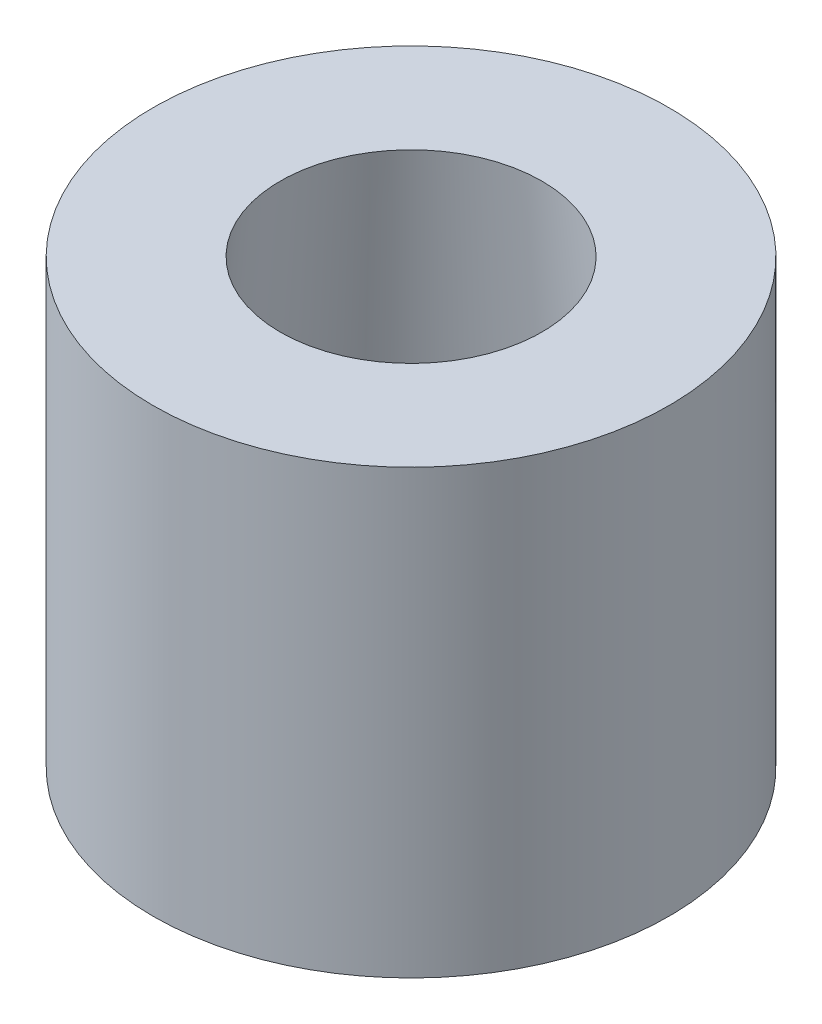
ISO-10303-21;
HEADER;
FILE_DESCRIPTION(('STEP AP214'),'2;1');
FILE_NAME('part.step','',(''),(''),'','','');
FILE_SCHEMA(('AUTOMOTIVE_DESIGN { 1 0 10303 214 1 1 1 1 }'));
ENDSEC;
DATA;
#1=APPLICATION_CONTEXT('core data for automotive mechanical design processes');
#2=APPLICATION_PROTOCOL_DEFINITION('international standard','automotive_design',2000,#1);
#3=PRODUCT_CONTEXT('',#1,'mechanical');
#4=PRODUCT('Part','Part','',(#3));
#5=PRODUCT_RELATED_PRODUCT_CATEGORY('part','',(#4));
#6=PRODUCT_DEFINITION_FORMATION('','',#4);
#7=PRODUCT_DEFINITION_CONTEXT('part definition',#1,'design');
#8=PRODUCT_DEFINITION('design','',#6,#7);
#9=PRODUCT_DEFINITION_SHAPE('','',#8);
#10=(LENGTH_UNIT() NAMED_UNIT(*) SI_UNIT(.MILLI.,.METRE.));
#11=(NAMED_UNIT(*) PLANE_ANGLE_UNIT() SI_UNIT($,.RADIAN.));
#12=(NAMED_UNIT(*) SI_UNIT($,.STERADIAN.) SOLID_ANGLE_UNIT());
#13=UNCERTAINTY_MEASURE_WITH_UNIT(LENGTH_MEASURE(1.E-05),#10,'distance_accuracy_value','');
#14=(GEOMETRIC_REPRESENTATION_CONTEXT(3) GLOBAL_UNCERTAINTY_ASSIGNED_CONTEXT((#13)) GLOBAL_UNIT_ASSIGNED_CONTEXT((#10,
#11,#12)) REPRESENTATION_CONTEXT('',''));
#15=CARTESIAN_POINT('',(0.,0.,0.));
#16=DIRECTION('',(0.,0.,1.));
#17=DIRECTION('',(1.,0.,0.));
#18=AXIS2_PLACEMENT_3D('',#15,#16,#17);
#19=CARTESIAN_POINT('',(0.,0.,0.));
#20=DIRECTION('',(0.,1.,0.));
#21=DIRECTION('',(0.,0.,1.));
#22=AXIS2_PLACEMENT_3D('',#19,#20,#21);
#23=PLANE('',#22);
#24=CARTESIAN_POINT('',(0.,0.,0.));
#25=DIRECTION('',(0.,-1.,0.));
#26=DIRECTION('',(0.,0.,-1.));
#27=AXIS2_PLACEMENT_3D('',#24,#25,#26);
#28=CIRCLE('',#27,11.5);
#29=CARTESIAN_POINT('',(0.,0.,-11.5));
#30=VERTEX_POINT('',#29);
#31=EDGE_CURVE('E52',#30,#30,#28,.T.);
#32=ORIENTED_EDGE('',*,*,#31,.F.);
#33=EDGE_LOOP('',(#32));
#34=FACE_BOUND('',#33,.T.);
#35=CARTESIAN_POINT('',(0.,0.,0.439504445523653));
#36=DIRECTION('',(0.,-1.,0.));
#37=DIRECTION('',(0.,0.,-1.));
#38=AXIS2_PLACEMENT_3D('',#35,#36,#37);
#39=CIRCLE('',#38,12.5);
#40=CARTESIAN_POINT('',(0.,0.,-12.0604955544763));
#41=VERTEX_POINT('',#40);
#42=EDGE_CURVE('E62',#41,#41,#39,.T.);
#43=ORIENTED_EDGE('',*,*,#42,.T.);
#44=EDGE_LOOP('',(#43));
#45=FACE_BOUND('',#44,.T.);
#46=ADVANCED_FACE('F37',(#34,#45),#23,.F.);
#47=CARTESIAN_POINT('',(0.,30.,0.));
#48=DIRECTION('',(0.,-1.,0.));
#49=DIRECTION('',(0.,0.,-1.));
#50=AXIS2_PLACEMENT_3D('',#47,#48,#49);
#51=CYLINDRICAL_SURFACE('',#50,17.5);
#52=CARTESIAN_POINT('',(0.,30.,0.));
#53=DIRECTION('',(0.,1.,0.));
#54=DIRECTION('',(0.,0.,1.));
#55=AXIS2_PLACEMENT_3D('',#52,#53,#54);
#56=CIRCLE('',#55,17.5);
#57=CARTESIAN_POINT('',(0.,30.,17.5));
#58=VERTEX_POINT('',#57);
#59=EDGE_CURVE('E10',#58,#58,#56,.T.);
#60=ORIENTED_EDGE('',*,*,#59,.F.);
#61=EDGE_LOOP('',(#60));
#62=FACE_BOUND('',#61,.T.);
#63=CARTESIAN_POINT('',(0.,0.,0.));
#64=DIRECTION('',(0.,1.,0.));
#65=DIRECTION('',(0.,0.,1.));
#66=AXIS2_PLACEMENT_3D('',#63,#64,#65);
#67=CIRCLE('',#66,17.5);
#68=CARTESIAN_POINT('',(0.,0.,17.5));
#69=VERTEX_POINT('',#68);
#70=EDGE_CURVE('E41',#69,#69,#67,.T.);
#71=ORIENTED_EDGE('',*,*,#70,.T.);
#72=EDGE_LOOP('',(#71));
#73=FACE_BOUND('',#72,.T.);
#74=ADVANCED_FACE('F39',(#62,#73),#51,.T.);
#75=CARTESIAN_POINT('',(0.,30.,0.));
#76=DIRECTION('',(0.,1.,0.));
#77=DIRECTION('',(0.,0.,1.));
#78=AXIS2_PLACEMENT_3D('',#75,#76,#77);
#79=PLANE('',#78);
#80=CARTESIAN_POINT('',(0.,30.,0.));
#81=DIRECTION('',(0.,-1.,0.));
#82=DIRECTION('',(0.,0.,-1.));
#83=AXIS2_PLACEMENT_3D('',#80,#81,#82);
#84=CIRCLE('',#83,8.87534009422228);
#85=CARTESIAN_POINT('',(0.,30.,-8.87534009422228));
#86=VERTEX_POINT('',#85);
#87=EDGE_CURVE('E48',#86,#86,#84,.T.);
#88=ORIENTED_EDGE('',*,*,#87,.T.);
#89=EDGE_LOOP('',(#88));
#90=FACE_BOUND('',#89,.T.);
#91=ORIENTED_EDGE('',*,*,#59,.T.);
#92=EDGE_LOOP('',(#91));
#93=FACE_BOUND('',#92,.T.);
#94=ADVANCED_FACE('F87',(#90,#93),#79,.T.);
#95=CARTESIAN_POINT('',(0.,0.,0.439504445523653));
#96=DIRECTION('',(0.,-1.,0.));
#97=DIRECTION('',(0.,0.,-1.));
#98=AXIS2_PLACEMENT_3D('',#95,#96,#97);
#99=CIRCLE('',#98,15.);
#100=CARTESIAN_POINT('',(0.,0.,-14.5604955544763));
#101=VERTEX_POINT('',#100);
#102=EDGE_CURVE('E56',#101,#101,#99,.T.);
#103=ORIENTED_EDGE('',*,*,#102,.F.);
#104=EDGE_LOOP('',(#103));
#105=FACE_BOUND('',#104,.T.);
#106=ORIENTED_EDGE('',*,*,#70,.F.);
#107=EDGE_LOOP('',(#106));
#108=FACE_BOUND('',#107,.T.);
#109=ADVANCED_FACE('F84',(#105,#108),#23,.F.);
#110=CARTESIAN_POINT('',(0.,0.,0.));
#111=DIRECTION('',(0.,-1.,0.));
#112=DIRECTION('',(0.,0.,-1.));
#113=AXIS2_PLACEMENT_3D('',#110,#111,#112);
#114=CONICAL_SURFACE('',#113,11.5,0.0872664625997165);
#115=ORIENTED_EDGE('',*,*,#87,.F.);
#116=EDGE_LOOP('',(#115));
#117=FACE_BOUND('',#116,.T.);
#118=ORIENTED_EDGE('',*,*,#31,.T.);
#119=EDGE_LOOP('',(#118));
#120=FACE_BOUND('',#119,.T.);
#121=ADVANCED_FACE('F80',(#117,#120),#114,.F.);
#122=CARTESIAN_POINT('',(0.,5.,0.439504445523653));
#123=DIRECTION('',(0.,-1.,0.));
#124=DIRECTION('',(0.,0.,-1.));
#125=AXIS2_PLACEMENT_3D('',#122,#123,#124);
#126=CYLINDRICAL_SURFACE('',#125,15.);
#127=CARTESIAN_POINT('',(0.,5.,0.439504445523653));
#128=DIRECTION('',(0.,-1.,0.));
#129=DIRECTION('',(0.,0.,-1.));
#130=AXIS2_PLACEMENT_3D('',#127,#128,#129);
#131=CIRCLE('',#130,15.);
#132=CARTESIAN_POINT('',(0.,5.,-14.5604955544763));
#133=VERTEX_POINT('',#132);
#134=EDGE_CURVE('E55',#133,#133,#131,.T.);
#135=ORIENTED_EDGE('',*,*,#134,.F.);
#136=EDGE_LOOP('',(#135));
#137=FACE_BOUND('',#136,.T.);
#138=ORIENTED_EDGE('',*,*,#102,.T.);
#139=EDGE_LOOP('',(#138));
#140=FACE_BOUND('',#139,.T.);
#141=ADVANCED_FACE('F74',(#137,#140),#126,.F.);
#142=CARTESIAN_POINT('',(0.,5.,0.439504445523653));
#143=DIRECTION('',(0.,-1.,0.));
#144=DIRECTION('',(0.,0.,-1.));
#145=AXIS2_PLACEMENT_3D('',#142,#143,#144);
#146=PLANE('',#145);
#147=CARTESIAN_POINT('',(0.,5.,0.439504445523653));
#148=DIRECTION('',(0.,-1.,0.));
#149=DIRECTION('',(0.,0.,-1.));
#150=AXIS2_PLACEMENT_3D('',#147,#148,#149);
#151=CIRCLE('',#150,12.5);
#152=CARTESIAN_POINT('',(0.,5.,-12.0604955544763));
#153=VERTEX_POINT('',#152);
#154=EDGE_CURVE('E59',#153,#153,#151,.T.);
#155=ORIENTED_EDGE('',*,*,#154,.F.);
#156=EDGE_LOOP('',(#155));
#157=FACE_BOUND('',#156,.T.);
#158=ORIENTED_EDGE('',*,*,#134,.T.);
#159=EDGE_LOOP('',(#158));
#160=FACE_BOUND('',#159,.T.);
#161=ADVANCED_FACE('F71',(#157,#160),#146,.T.);
#162=CARTESIAN_POINT('',(0.,5.,0.439504445523653));
#163=DIRECTION('',(0.,-1.,0.));
#164=DIRECTION('',(0.,0.,-1.));
#165=AXIS2_PLACEMENT_3D('',#162,#163,#164);
#166=CYLINDRICAL_SURFACE('',#165,12.5);
#167=ORIENTED_EDGE('',*,*,#154,.T.);
#168=EDGE_LOOP('',(#167));
#169=FACE_BOUND('',#168,.T.);
#170=ORIENTED_EDGE('',*,*,#42,.F.);
#171=EDGE_LOOP('',(#170));
#172=FACE_BOUND('',#171,.T.);
#173=ADVANCED_FACE('F68',(#169,#172),#166,.T.);
#174=CLOSED_SHELL('',(#46,#74,#94,#109,#121,#141,#161,#173));
#175=MANIFOLD_SOLID_BREP('B2',#174);
#176=ADVANCED_BREP_SHAPE_REPRESENTATION('',(#18,#175),#14);
#177=SHAPE_DEFINITION_REPRESENTATION(#9,#176);
ENDSEC;
END-ISO-10303-21;
